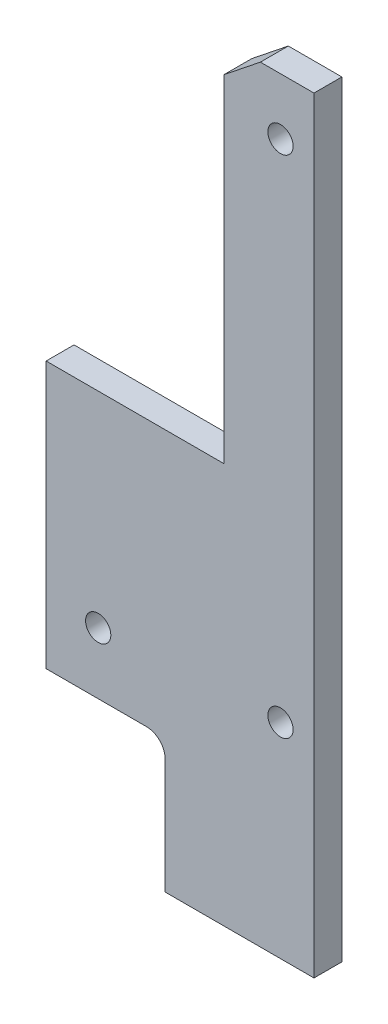
ISO-10303-21;
HEADER;
FILE_DESCRIPTION(('STEP AP214'),'2;1');
FILE_NAME('part.step','',(''),(''),'','','');
FILE_SCHEMA(('AUTOMOTIVE_DESIGN { 1 0 10303 214 1 1 1 1 }'));
ENDSEC;
DATA;
#1=APPLICATION_CONTEXT('core data for automotive mechanical design processes');
#2=APPLICATION_PROTOCOL_DEFINITION('international standard','automotive_design',2000,#1);
#3=PRODUCT_CONTEXT('',#1,'mechanical');
#4=PRODUCT('Part','Part','',(#3));
#5=PRODUCT_RELATED_PRODUCT_CATEGORY('part','',(#4));
#6=PRODUCT_DEFINITION_FORMATION('','',#4);
#7=PRODUCT_DEFINITION_CONTEXT('part definition',#1,'design');
#8=PRODUCT_DEFINITION('design','',#6,#7);
#9=PRODUCT_DEFINITION_SHAPE('','',#8);
#10=(LENGTH_UNIT() NAMED_UNIT(*) SI_UNIT(.MILLI.,.METRE.));
#11=(NAMED_UNIT(*) PLANE_ANGLE_UNIT() SI_UNIT($,.RADIAN.));
#12=(NAMED_UNIT(*) SI_UNIT($,.STERADIAN.) SOLID_ANGLE_UNIT());
#13=UNCERTAINTY_MEASURE_WITH_UNIT(LENGTH_MEASURE(1.E-05),#10,'distance_accuracy_value','');
#14=(GEOMETRIC_REPRESENTATION_CONTEXT(3) GLOBAL_UNCERTAINTY_ASSIGNED_CONTEXT((#13)) GLOBAL_UNIT_ASSIGNED_CONTEXT((#10,
#11,#12)) REPRESENTATION_CONTEXT('',''));
#15=CARTESIAN_POINT('',(0.,0.,0.));
#16=DIRECTION('',(0.,0.,1.));
#17=DIRECTION('',(1.,0.,0.));
#18=AXIS2_PLACEMENT_3D('',#15,#16,#17);
#19=CARTESIAN_POINT('',(-15.3921385119326,125.820167160609,4.7625));
#20=DIRECTION('',(0.624033070240707,-0.781397931431839,0.));
#21=DIRECTION('',(0.781397931431839,0.624033070240707,0.));
#22=AXIS2_PLACEMENT_3D('',#19,#20,#21);
#23=PLANE('',#22);
#24=DIRECTION('',(-0.781397931431839,-0.624033070240707,0.));
#25=VECTOR('',#24,1.);
#26=CARTESIAN_POINT('',(-15.3921385119326,125.820167160609,0.));
#27=LINE('',#26,#25);
#28=CARTESIAN_POINT('',(-9.144,130.81,0.));
#29=VERTEX_POINT('',#28);
#30=CARTESIAN_POINT('',(-15.3921385119326,125.820167160609,0.));
#31=VERTEX_POINT('',#30);
#32=EDGE_CURVE('E145',#29,#31,#27,.T.);
#33=ORIENTED_EDGE('',*,*,#32,.T.);
#34=DIRECTION('',(0.,0.,-1.));
#35=VECTOR('',#34,1.);
#36=CARTESIAN_POINT('',(-15.3921385119326,125.820167160609,4.7625));
#37=LINE('',#36,#35);
#38=CARTESIAN_POINT('',(-15.3921385119326,125.820167160609,4.7625));
#39=VERTEX_POINT('',#38);
#40=EDGE_CURVE('E11',#39,#31,#37,.T.);
#41=ORIENTED_EDGE('',*,*,#40,.F.);
#42=DIRECTION('',(-0.781397931431839,-0.624033070240707,0.));
#43=VECTOR('',#42,1.);
#44=CARTESIAN_POINT('',(-15.3921385119326,125.820167160609,4.7625));
#45=LINE('',#44,#43);
#46=CARTESIAN_POINT('',(-9.144,130.81,4.7625));
#47=VERTEX_POINT('',#46);
#48=EDGE_CURVE('E164',#47,#39,#45,.T.);
#49=ORIENTED_EDGE('',*,*,#48,.F.);
#50=DIRECTION('',(0.,0.,-1.));
#51=VECTOR('',#50,1.);
#52=CARTESIAN_POINT('',(-9.144,130.81,4.7625));
#53=LINE('',#52,#51);
#54=EDGE_CURVE('E141',#47,#29,#53,.T.);
#55=ORIENTED_EDGE('',*,*,#54,.T.);
#56=EDGE_LOOP('',(#33,#41,#49,#55));
#57=FACE_BOUND('',#56,.T.);
#58=ADVANCED_FACE('F37',(#57),#23,.F.);
#59=CARTESIAN_POINT('',(-15.3921385119326,125.820167160609,4.7625));
#60=DIRECTION('',(1.,0.,0.));
#61=DIRECTION('',(0.,1.,0.));
#62=AXIS2_PLACEMENT_3D('',#59,#60,#61);
#63=PLANE('',#62);
#64=DIRECTION('',(0.,-1.,0.));
#65=VECTOR('',#64,1.);
#66=CARTESIAN_POINT('',(-15.3921385119326,125.820167160609,0.));
#67=LINE('',#66,#65);
#68=CARTESIAN_POINT('',(-15.3921385119326,68.3431750116986,0.));
#69=VERTEX_POINT('',#68);
#70=EDGE_CURVE('E148',#31,#69,#67,.T.);
#71=ORIENTED_EDGE('',*,*,#70,.T.);
#72=DIRECTION('',(0.,0.,-1.));
#73=VECTOR('',#72,1.);
#74=CARTESIAN_POINT('',(-15.3921385119326,68.3431750116986,4.7625));
#75=LINE('',#74,#73);
#76=CARTESIAN_POINT('',(-15.3921385119326,68.3431750116986,4.7625));
#77=VERTEX_POINT('',#76);
#78=EDGE_CURVE('E45',#77,#69,#75,.T.);
#79=ORIENTED_EDGE('',*,*,#78,.F.);
#80=DIRECTION('',(0.,-1.,0.));
#81=VECTOR('',#80,1.);
#82=CARTESIAN_POINT('',(-15.3921385119326,125.820167160609,4.7625));
#83=LINE('',#82,#81);
#84=EDGE_CURVE('E102',#39,#77,#83,.T.);
#85=ORIENTED_EDGE('',*,*,#84,.F.);
#86=ORIENTED_EDGE('',*,*,#40,.T.);
#87=EDGE_LOOP('',(#71,#79,#85,#86));
#88=FACE_BOUND('',#87,.T.);
#89=ADVANCED_FACE('F258',(#88),#63,.F.);
#90=CARTESIAN_POINT('',(-15.3921385119326,68.3431750116986,4.7625));
#91=DIRECTION('',(0.,-1.,0.));
#92=DIRECTION('',(0.,0.,-1.));
#93=AXIS2_PLACEMENT_3D('',#90,#91,#92);
#94=PLANE('',#93);
#95=DIRECTION('',(-1.,0.,0.));
#96=VECTOR('',#95,1.);
#97=CARTESIAN_POINT('',(-15.3921385119326,68.3431750116986,0.));
#98=LINE('',#97,#96);
#99=CARTESIAN_POINT('',(-45.72,68.3431750116986,0.));
#100=VERTEX_POINT('',#99);
#101=EDGE_CURVE('E151',#69,#100,#98,.T.);
#102=ORIENTED_EDGE('',*,*,#101,.T.);
#103=DIRECTION('',(0.,0.,-1.));
#104=VECTOR('',#103,1.);
#105=CARTESIAN_POINT('',(-45.72,68.3431750116986,4.7625));
#106=LINE('',#105,#104);
#107=CARTESIAN_POINT('',(-45.72,68.3431750116986,4.7625));
#108=VERTEX_POINT('',#107);
#109=EDGE_CURVE('E177',#108,#100,#106,.T.);
#110=ORIENTED_EDGE('',*,*,#109,.F.);
#111=DIRECTION('',(-1.,0.,0.));
#112=VECTOR('',#111,1.);
#113=CARTESIAN_POINT('',(-15.3921385119326,68.3431750116986,4.7625));
#114=LINE('',#113,#112);
#115=EDGE_CURVE('E185',#77,#108,#114,.T.);
#116=ORIENTED_EDGE('',*,*,#115,.F.);
#117=ORIENTED_EDGE('',*,*,#78,.T.);
#118=EDGE_LOOP('',(#102,#110,#116,#117));
#119=FACE_BOUND('',#118,.T.);
#120=ADVANCED_FACE('F183',(#119),#94,.F.);
#121=CARTESIAN_POINT('',(-45.72,68.3431750116986,4.7625));
#122=DIRECTION('',(1.,0.,0.));
#123=DIRECTION('',(0.,1.,0.));
#124=AXIS2_PLACEMENT_3D('',#121,#122,#123);
#125=PLANE('',#124);
#126=DIRECTION('',(0.,-1.,0.));
#127=VECTOR('',#126,1.);
#128=CARTESIAN_POINT('',(-45.72,68.3431750116986,0.));
#129=LINE('',#128,#127);
#130=CARTESIAN_POINT('',(-45.72,22.86,0.));
#131=VERTEX_POINT('',#130);
#132=EDGE_CURVE('E153',#100,#131,#129,.T.);
#133=ORIENTED_EDGE('',*,*,#132,.T.);
#134=DIRECTION('',(0.,0.,-1.));
#135=VECTOR('',#134,1.);
#136=CARTESIAN_POINT('',(-45.72,22.86,4.7625));
#137=LINE('',#136,#135);
#138=CARTESIAN_POINT('',(-45.72,22.86,4.7625));
#139=VERTEX_POINT('',#138);
#140=EDGE_CURVE('E174',#139,#131,#137,.T.);
#141=ORIENTED_EDGE('',*,*,#140,.F.);
#142=DIRECTION('',(0.,-1.,0.));
#143=VECTOR('',#142,1.);
#144=CARTESIAN_POINT('',(-45.72,68.3431750116986,4.7625));
#145=LINE('',#144,#143);
#146=EDGE_CURVE('E203',#108,#139,#145,.T.);
#147=ORIENTED_EDGE('',*,*,#146,.F.);
#148=ORIENTED_EDGE('',*,*,#109,.T.);
#149=EDGE_LOOP('',(#133,#141,#147,#148));
#150=FACE_BOUND('',#149,.T.);
#151=ADVANCED_FACE('F194',(#150),#125,.F.);
#152=CARTESIAN_POINT('',(-45.72,22.86,4.7625));
#153=DIRECTION('',(0.,1.,0.));
#154=DIRECTION('',(0.,0.,1.));
#155=AXIS2_PLACEMENT_3D('',#152,#153,#154);
#156=PLANE('',#155);
#157=DIRECTION('',(1.,0.,0.));
#158=VECTOR('',#157,1.);
#159=CARTESIAN_POINT('',(-45.72,22.86,0.));
#160=LINE('',#159,#158);
#161=CARTESIAN_POINT('',(-28.575,22.86,0.));
#162=VERTEX_POINT('',#161);
#163=EDGE_CURVE('E155',#131,#162,#160,.T.);
#164=ORIENTED_EDGE('',*,*,#163,.T.);
#165=DIRECTION('',(0.,0.,-1.));
#166=VECTOR('',#165,1.);
#167=CARTESIAN_POINT('',(-28.575,22.86,4.7625));
#168=LINE('',#167,#166);
#169=CARTESIAN_POINT('',(-28.575,22.86,4.7625));
#170=VERTEX_POINT('',#169);
#171=EDGE_CURVE('E171',#170,#162,#168,.T.);
#172=ORIENTED_EDGE('',*,*,#171,.F.);
#173=DIRECTION('',(1.,0.,0.));
#174=VECTOR('',#173,1.);
#175=CARTESIAN_POINT('',(-45.72,22.86,4.7625));
#176=LINE('',#175,#174);
#177=EDGE_CURVE('E200',#139,#170,#176,.T.);
#178=ORIENTED_EDGE('',*,*,#177,.F.);
#179=ORIENTED_EDGE('',*,*,#140,.T.);
#180=EDGE_LOOP('',(#164,#172,#178,#179));
#181=FACE_BOUND('',#180,.T.);
#182=ADVANCED_FACE('F198',(#181),#156,.F.);
#183=CARTESIAN_POINT('',(-28.575,19.685,4.7625));
#184=DIRECTION('',(0.,0.,-1.));
#185=DIRECTION('',(-1.,0.,0.));
#186=AXIS2_PLACEMENT_3D('',#183,#184,#185);
#187=CYLINDRICAL_SURFACE('',#186,3.17499999999999);
#188=CARTESIAN_POINT('',(-28.575,19.685,0.));
#189=DIRECTION('',(0.,0.,-1.));
#190=DIRECTION('',(1.,0.,0.));
#191=AXIS2_PLACEMENT_3D('',#188,#189,#190);
#192=CIRCLE('',#191,3.17499999999999);
#193=CARTESIAN_POINT('',(-25.4,19.685,0.));
#194=VERTEX_POINT('',#193);
#195=EDGE_CURVE('E157',#162,#194,#192,.T.);
#196=ORIENTED_EDGE('',*,*,#195,.T.);
#197=DIRECTION('',(0.,0.,-1.));
#198=VECTOR('',#197,1.);
#199=CARTESIAN_POINT('',(-25.4,19.685,4.7625));
#200=LINE('',#199,#198);
#201=CARTESIAN_POINT('',(-25.4,19.685,4.7625));
#202=VERTEX_POINT('',#201);
#203=EDGE_CURVE('E168',#202,#194,#200,.T.);
#204=ORIENTED_EDGE('',*,*,#203,.F.);
#205=CARTESIAN_POINT('',(-28.575,19.685,4.7625));
#206=DIRECTION('',(0.,0.,-1.));
#207=DIRECTION('',(1.,0.,0.));
#208=AXIS2_PLACEMENT_3D('',#205,#206,#207);
#209=CIRCLE('',#208,3.17499999999999);
#210=EDGE_CURVE('E202',#170,#202,#209,.T.);
#211=ORIENTED_EDGE('',*,*,#210,.F.);
#212=ORIENTED_EDGE('',*,*,#171,.T.);
#213=EDGE_LOOP('',(#196,#204,#211,#212));
#214=FACE_BOUND('',#213,.T.);
#215=ADVANCED_FACE('F270',(#214),#187,.F.);
#216=CARTESIAN_POINT('',(-25.4,19.685,4.7625));
#217=DIRECTION('',(1.,0.,0.));
#218=DIRECTION('',(0.,1.,0.));
#219=AXIS2_PLACEMENT_3D('',#216,#217,#218);
#220=PLANE('',#219);
#221=DIRECTION('',(0.,-1.,0.));
#222=VECTOR('',#221,1.);
#223=CARTESIAN_POINT('',(-25.4,19.685,0.));
#224=LINE('',#223,#222);
#225=CARTESIAN_POINT('',(-25.4,0.,0.));
#226=VERTEX_POINT('',#225);
#227=EDGE_CURVE('E159',#194,#226,#224,.T.);
#228=ORIENTED_EDGE('',*,*,#227,.T.);
#229=DIRECTION('',(0.,0.,-1.));
#230=VECTOR('',#229,1.);
#231=CARTESIAN_POINT('',(-25.4,0.,4.7625));
#232=LINE('',#231,#230);
#233=CARTESIAN_POINT('',(-25.4,0.,4.7625));
#234=VERTEX_POINT('',#233);
#235=EDGE_CURVE('E136',#234,#226,#232,.T.);
#236=ORIENTED_EDGE('',*,*,#235,.F.);
#237=DIRECTION('',(0.,-1.,0.));
#238=VECTOR('',#237,1.);
#239=CARTESIAN_POINT('',(-25.4,19.685,4.7625));
#240=LINE('',#239,#238);
#241=EDGE_CURVE('E127',#202,#234,#240,.T.);
#242=ORIENTED_EDGE('',*,*,#241,.F.);
#243=ORIENTED_EDGE('',*,*,#203,.T.);
#244=EDGE_LOOP('',(#228,#236,#242,#243));
#245=FACE_BOUND('',#244,.T.);
#246=ADVANCED_FACE('F267',(#245),#220,.F.);
#247=CARTESIAN_POINT('',(-25.4,0.,4.7625));
#248=DIRECTION('',(0.,1.,0.));
#249=DIRECTION('',(0.,0.,1.));
#250=AXIS2_PLACEMENT_3D('',#247,#248,#249);
#251=PLANE('',#250);
#252=DIRECTION('',(1.,0.,0.));
#253=VECTOR('',#252,1.);
#254=CARTESIAN_POINT('',(-25.4,0.,0.));
#255=LINE('',#254,#253);
#256=CARTESIAN_POINT('',(0.,0.,0.));
#257=VERTEX_POINT('',#256);
#258=EDGE_CURVE('E135',#226,#257,#255,.T.);
#259=ORIENTED_EDGE('',*,*,#258,.T.);
#260=DIRECTION('',(0.,0.,-1.));
#261=VECTOR('',#260,1.);
#262=CARTESIAN_POINT('',(0.,0.,4.7625));
#263=LINE('',#262,#261);
#264=CARTESIAN_POINT('',(0.,0.,4.7625));
#265=VERTEX_POINT('',#264);
#266=EDGE_CURVE('E132',#265,#257,#263,.T.);
#267=ORIENTED_EDGE('',*,*,#266,.F.);
#268=DIRECTION('',(1.,0.,0.));
#269=VECTOR('',#268,1.);
#270=CARTESIAN_POINT('',(-25.4,0.,4.7625));
#271=LINE('',#270,#269);
#272=EDGE_CURVE('E121',#234,#265,#271,.T.);
#273=ORIENTED_EDGE('',*,*,#272,.F.);
#274=ORIENTED_EDGE('',*,*,#235,.T.);
#275=EDGE_LOOP('',(#259,#267,#273,#274));
#276=FACE_BOUND('',#275,.T.);
#277=ADVANCED_FACE('F133',(#276),#251,.F.);
#278=CARTESIAN_POINT('',(0.,130.81,4.7625));
#279=DIRECTION('',(-1.,0.,0.));
#280=DIRECTION('',(0.,-1.,0.));
#281=AXIS2_PLACEMENT_3D('',#278,#279,#280);
#282=PLANE('',#281);
#283=DIRECTION('',(0.,1.,0.));
#284=VECTOR('',#283,1.);
#285=CARTESIAN_POINT('',(0.,130.81,0.));
#286=LINE('',#285,#284);
#287=CARTESIAN_POINT('',(0.,130.81,0.));
#288=VERTEX_POINT('',#287);
#289=EDGE_CURVE('E88',#257,#288,#286,.T.);
#290=ORIENTED_EDGE('',*,*,#289,.T.);
#291=DIRECTION('',(0.,0.,-1.));
#292=VECTOR('',#291,1.);
#293=CARTESIAN_POINT('',(0.,130.81,4.7625));
#294=LINE('',#293,#292);
#295=CARTESIAN_POINT('',(0.,130.81,4.7625));
#296=VERTEX_POINT('',#295);
#297=EDGE_CURVE('E137',#296,#288,#294,.T.);
#298=ORIENTED_EDGE('',*,*,#297,.F.);
#299=DIRECTION('',(0.,1.,0.));
#300=VECTOR('',#299,1.);
#301=CARTESIAN_POINT('',(0.,130.81,4.7625));
#302=LINE('',#301,#300);
#303=EDGE_CURVE('E125',#265,#296,#302,.T.);
#304=ORIENTED_EDGE('',*,*,#303,.F.);
#305=ORIENTED_EDGE('',*,*,#266,.T.);
#306=EDGE_LOOP('',(#290,#298,#304,#305));
#307=FACE_BOUND('',#306,.T.);
#308=ADVANCED_FACE('F139',(#307),#282,.F.);
#309=CARTESIAN_POINT('',(-9.144,130.81,4.7625));
#310=DIRECTION('',(0.,-1.,0.));
#311=DIRECTION('',(0.,0.,-1.));
#312=AXIS2_PLACEMENT_3D('',#309,#310,#311);
#313=PLANE('',#312);
#314=DIRECTION('',(-1.,0.,0.));
#315=VECTOR('',#314,1.);
#316=CARTESIAN_POINT('',(-9.144,130.81,0.));
#317=LINE('',#316,#315);
#318=EDGE_CURVE('E94',#288,#29,#317,.T.);
#319=ORIENTED_EDGE('',*,*,#318,.T.);
#320=ORIENTED_EDGE('',*,*,#54,.F.);
#321=DIRECTION('',(-1.,0.,0.));
#322=VECTOR('',#321,1.);
#323=CARTESIAN_POINT('',(-9.144,130.81,4.7625));
#324=LINE('',#323,#322);
#325=EDGE_CURVE('E53',#296,#47,#324,.T.);
#326=ORIENTED_EDGE('',*,*,#325,.F.);
#327=ORIENTED_EDGE('',*,*,#297,.T.);
#328=EDGE_LOOP('',(#319,#320,#326,#327));
#329=FACE_BOUND('',#328,.T.);
#330=ADVANCED_FACE('F322',(#329),#313,.F.);
#331=CARTESIAN_POINT('',(-28.575,19.685,4.7625));
#332=DIRECTION('',(0.,0.,1.));
#333=DIRECTION('',(1.,0.,0.));
#334=AXIS2_PLACEMENT_3D('',#331,#332,#333);
#335=PLANE('',#334);
#336=CARTESIAN_POINT('',(-5.715,121.158,4.7625));
#337=DIRECTION('',(0.,0.,-1.));
#338=DIRECTION('',(-1.,0.,0.));
#339=AXIS2_PLACEMENT_3D('',#336,#337,#338);
#340=CIRCLE('',#339,2.15265);
#341=CARTESIAN_POINT('',(-7.86765,121.158,4.7625));
#342=VERTEX_POINT('',#341);
#343=EDGE_CURVE('E149',#342,#342,#340,.T.);
#344=ORIENTED_EDGE('',*,*,#343,.T.);
#345=EDGE_LOOP('',(#344));
#346=FACE_BOUND('',#345,.T.);
#347=CARTESIAN_POINT('',(-36.83,33.3375,4.7625));
#348=DIRECTION('',(0.,0.,-1.));
#349=DIRECTION('',(-1.,0.,0.));
#350=AXIS2_PLACEMENT_3D('',#347,#348,#349);
#351=CIRCLE('',#350,2.15265);
#352=CARTESIAN_POINT('',(-38.98265,33.3375,4.7625));
#353=VERTEX_POINT('',#352);
#354=EDGE_CURVE('E220',#353,#353,#351,.T.);
#355=ORIENTED_EDGE('',*,*,#354,.T.);
#356=EDGE_LOOP('',(#355));
#357=FACE_BOUND('',#356,.T.);
#358=CARTESIAN_POINT('',(-5.715,34.925,4.7625));
#359=DIRECTION('',(0.,0.,-1.));
#360=DIRECTION('',(-1.,0.,0.));
#361=AXIS2_PLACEMENT_3D('',#358,#359,#360);
#362=CIRCLE('',#361,2.15265);
#363=CARTESIAN_POINT('',(-7.86764999999999,34.925,4.7625));
#364=VERTEX_POINT('',#363);
#365=EDGE_CURVE('E214',#364,#364,#362,.T.);
#366=ORIENTED_EDGE('',*,*,#365,.T.);
#367=EDGE_LOOP('',(#366));
#368=FACE_BOUND('',#367,.T.);
#369=ORIENTED_EDGE('',*,*,#48,.T.);
#370=ORIENTED_EDGE('',*,*,#84,.T.);
#371=ORIENTED_EDGE('',*,*,#115,.T.);
#372=ORIENTED_EDGE('',*,*,#146,.T.);
#373=ORIENTED_EDGE('',*,*,#177,.T.);
#374=ORIENTED_EDGE('',*,*,#210,.T.);
#375=ORIENTED_EDGE('',*,*,#241,.T.);
#376=ORIENTED_EDGE('',*,*,#272,.T.);
#377=ORIENTED_EDGE('',*,*,#303,.T.);
#378=ORIENTED_EDGE('',*,*,#325,.T.);
#379=EDGE_LOOP('',(#369,#370,#371,#372,#373,#374,#375,#376,#377,#378));
#380=FACE_BOUND('',#379,.T.);
#381=ADVANCED_FACE('F123',(#346,#357,#368,#380),#335,.T.);
#382=CARTESIAN_POINT('',(-28.575,19.685,0.));
#383=DIRECTION('',(0.,0.,1.));
#384=DIRECTION('',(1.,0.,0.));
#385=AXIS2_PLACEMENT_3D('',#382,#383,#384);
#386=PLANE('',#385);
#387=CARTESIAN_POINT('',(-5.715,121.158,0.));
#388=DIRECTION('',(0.,0.,-1.));
#389=DIRECTION('',(-1.,0.,0.));
#390=AXIS2_PLACEMENT_3D('',#387,#388,#389);
#391=CIRCLE('',#390,2.15265);
#392=CARTESIAN_POINT('',(-7.86765,121.158,0.));
#393=VERTEX_POINT('',#392);
#394=EDGE_CURVE('E223',#393,#393,#391,.T.);
#395=ORIENTED_EDGE('',*,*,#394,.F.);
#396=EDGE_LOOP('',(#395));
#397=FACE_BOUND('',#396,.T.);
#398=CARTESIAN_POINT('',(-36.83,33.3375,0.));
#399=DIRECTION('',(0.,0.,-1.));
#400=DIRECTION('',(-1.,0.,0.));
#401=AXIS2_PLACEMENT_3D('',#398,#399,#400);
#402=CIRCLE('',#401,2.15265);
#403=CARTESIAN_POINT('',(-38.98265,33.3375,0.));
#404=VERTEX_POINT('',#403);
#405=EDGE_CURVE('E217',#404,#404,#402,.T.);
#406=ORIENTED_EDGE('',*,*,#405,.F.);
#407=EDGE_LOOP('',(#406));
#408=FACE_BOUND('',#407,.T.);
#409=CARTESIAN_POINT('',(-5.715,34.925,0.));
#410=DIRECTION('',(0.,0.,-1.));
#411=DIRECTION('',(-1.,0.,0.));
#412=AXIS2_PLACEMENT_3D('',#409,#410,#411);
#413=CIRCLE('',#412,2.15265);
#414=CARTESIAN_POINT('',(-7.86764999999999,34.925,0.));
#415=VERTEX_POINT('',#414);
#416=EDGE_CURVE('E211',#415,#415,#413,.T.);
#417=ORIENTED_EDGE('',*,*,#416,.F.);
#418=EDGE_LOOP('',(#417));
#419=FACE_BOUND('',#418,.T.);
#420=ORIENTED_EDGE('',*,*,#32,.F.);
#421=ORIENTED_EDGE('',*,*,#318,.F.);
#422=ORIENTED_EDGE('',*,*,#289,.F.);
#423=ORIENTED_EDGE('',*,*,#258,.F.);
#424=ORIENTED_EDGE('',*,*,#227,.F.);
#425=ORIENTED_EDGE('',*,*,#195,.F.);
#426=ORIENTED_EDGE('',*,*,#163,.F.);
#427=ORIENTED_EDGE('',*,*,#132,.F.);
#428=ORIENTED_EDGE('',*,*,#101,.F.);
#429=ORIENTED_EDGE('',*,*,#70,.F.);
#430=EDGE_LOOP('',(#420,#421,#422,#423,#424,#425,#426,#427,#428,#429));
#431=FACE_BOUND('',#430,.T.);
#432=ADVANCED_FACE('F189',(#397,#408,#419,#431),#386,.F.);
#433=CARTESIAN_POINT('',(-5.715,34.925,4.7625));
#434=DIRECTION('',(0.,0.,-1.));
#435=DIRECTION('',(-1.,0.,0.));
#436=AXIS2_PLACEMENT_3D('',#433,#434,#435);
#437=CYLINDRICAL_SURFACE('',#436,2.15265);
#438=CARTESIAN_POINT('',(-7.86764999999999,34.925,4.7625));
#439=CARTESIAN_POINT('',(-7.86764999999999,34.925,4.712890625));
#440=CARTESIAN_POINT('',(-7.86764999999999,34.925,4.66328125));
#441=CARTESIAN_POINT('',(-7.86764999999999,34.925,4.5640625));
#442=CARTESIAN_POINT('',(-7.86764999999999,34.925,4.514453125));
#443=CARTESIAN_POINT('',(-7.86764999999999,34.925,4.415234375));
#444=CARTESIAN_POINT('',(-7.86764999999999,34.925,4.365625));
#445=CARTESIAN_POINT('',(-7.86764999999999,34.925,4.26640625));
#446=CARTESIAN_POINT('',(-7.86764999999999,34.925,4.216796875));
#447=CARTESIAN_POINT('',(-7.86764999999999,34.925,4.117578125));
#448=CARTESIAN_POINT('',(-7.86764999999999,34.925,4.06796875));
#449=CARTESIAN_POINT('',(-7.86764999999999,34.925,3.96875));
#450=CARTESIAN_POINT('',(-7.86764999999999,34.925,3.919140625));
#451=CARTESIAN_POINT('',(-7.86764999999999,34.925,3.819921875));
#452=CARTESIAN_POINT('',(-7.86764999999999,34.925,3.7703125));
#453=CARTESIAN_POINT('',(-7.86764999999999,34.925,3.67109375));
#454=CARTESIAN_POINT('',(-7.86764999999999,34.925,3.621484375));
#455=CARTESIAN_POINT('',(-7.86764999999999,34.925,3.522265625));
#456=CARTESIAN_POINT('',(-7.86764999999999,34.925,3.47265625));
#457=CARTESIAN_POINT('',(-7.86764999999999,34.925,3.3734375));
#458=CARTESIAN_POINT('',(-7.86764999999999,34.925,3.323828125));
#459=CARTESIAN_POINT('',(-7.86764999999999,34.925,3.224609375));
#460=CARTESIAN_POINT('',(-7.86764999999999,34.925,3.175));
#461=CARTESIAN_POINT('',(-7.86764999999999,34.925,3.07578125));
#462=CARTESIAN_POINT('',(-7.86764999999999,34.925,3.026171875));
#463=CARTESIAN_POINT('',(-7.86764999999999,34.925,2.926953125));
#464=CARTESIAN_POINT('',(-7.86764999999999,34.925,2.87734375));
#465=CARTESIAN_POINT('',(-7.86764999999999,34.925,2.778125));
#466=CARTESIAN_POINT('',(-7.86764999999999,34.925,2.728515625));
#467=CARTESIAN_POINT('',(-7.86764999999999,34.925,2.629296875));
#468=CARTESIAN_POINT('',(-7.86764999999999,34.925,2.5796875));
#469=CARTESIAN_POINT('',(-7.86764999999999,34.925,2.48046875));
#470=CARTESIAN_POINT('',(-7.86764999999999,34.925,2.430859375));
#471=CARTESIAN_POINT('',(-7.86764999999999,34.925,2.331640625));
#472=CARTESIAN_POINT('',(-7.86764999999999,34.925,2.28203125));
#473=CARTESIAN_POINT('',(-7.86764999999999,34.925,2.1828125));
#474=CARTESIAN_POINT('',(-7.86764999999999,34.925,2.133203125));
#475=CARTESIAN_POINT('',(-7.86764999999999,34.925,2.033984375));
#476=CARTESIAN_POINT('',(-7.86764999999999,34.925,1.984375));
#477=CARTESIAN_POINT('',(-7.86764999999999,34.925,1.88515625));
#478=CARTESIAN_POINT('',(-7.86764999999999,34.925,1.835546875));
#479=CARTESIAN_POINT('',(-7.86764999999999,34.925,1.736328125));
#480=CARTESIAN_POINT('',(-7.86764999999999,34.925,1.68671875));
#481=CARTESIAN_POINT('',(-7.86764999999999,34.925,1.5875));
#482=CARTESIAN_POINT('',(-7.86764999999999,34.925,1.537890625));
#483=CARTESIAN_POINT('',(-7.86764999999999,34.925,1.438671875));
#484=CARTESIAN_POINT('',(-7.86764999999999,34.925,1.3890625));
#485=CARTESIAN_POINT('',(-7.86764999999999,34.925,1.28984375));
#486=CARTESIAN_POINT('',(-7.86764999999999,34.925,1.240234375));
#487=CARTESIAN_POINT('',(-7.86764999999999,34.925,1.141015625));
#488=CARTESIAN_POINT('',(-7.86764999999999,34.925,1.09140625));
#489=CARTESIAN_POINT('',(-7.86764999999999,34.925,0.9921875));
#490=CARTESIAN_POINT('',(-7.86764999999999,34.925,0.942578125));
#491=CARTESIAN_POINT('',(-7.86764999999999,34.925,0.843359375));
#492=CARTESIAN_POINT('',(-7.86764999999999,34.925,0.79375));
#493=CARTESIAN_POINT('',(-7.86764999999999,34.925,0.69453125));
#494=CARTESIAN_POINT('',(-7.86764999999999,34.925,0.644921875));
#495=CARTESIAN_POINT('',(-7.86764999999999,34.925,0.545703125));
#496=CARTESIAN_POINT('',(-7.86764999999999,34.925,0.49609375));
#497=CARTESIAN_POINT('',(-7.86764999999999,34.925,0.396875));
#498=CARTESIAN_POINT('',(-7.86764999999999,34.925,0.347265625));
#499=CARTESIAN_POINT('',(-7.86764999999999,34.925,0.248046875));
#500=CARTESIAN_POINT('',(-7.86764999999999,34.925,0.1984375));
#501=CARTESIAN_POINT('',(-7.86764999999999,34.925,0.09921875));
#502=CARTESIAN_POINT('',(-7.86764999999999,34.925,0.049609375));
#503=CARTESIAN_POINT('',(-7.86764999999999,34.925,0.));
#504=B_SPLINE_CURVE_WITH_KNOTS('',3,(#438,#439,#440,#441,#442,#443,#444,#445,#446,#447,#448,
#449,#450,#451,#452,#453,#454,#455,#456,#457,#458,#459,#460,#461,#462,#463,#464,#465,#466,#467,
#468,#469,#470,#471,#472,#473,#474,#475,#476,#477,#478,#479,#480,#481,#482,#483,#484,#485,#486,
#487,#488,#489,#490,#491,#492,#493,#494,#495,#496,#497,#498,#499,#500,#501,#502,#503),
.UNSPECIFIED.,.F.,.F.,(4,2,2,2,2,2,2,2,2,2,2,2,2,2,2,2,2,2,2,2,2,2,2,2,2,2,2,2,2,2,2,2,4),(0.,
0.148828125,0.29765625,0.446484375,0.5953125,0.744140625,0.892968750000001,1.041796875,1.190625,
1.339453125,1.48828125,1.637109375,1.7859375,1.934765625,2.08359375,2.232421875,2.38125,
2.530078125,2.67890625,2.827734375,2.9765625,3.125390625,3.27421875,3.423046875,3.571875,
3.720703125,3.86953125,4.018359375,4.1671875,4.316015625,4.46484375,4.613671875,4.7625),.UNSPECIFIED.);
#505=EDGE_CURVE('BSEAM240',#364,#415,#504,.T.);
#506=ORIENTED_EDGE('',*,*,#365,.F.);
#507=ORIENTED_EDGE('',*,*,#416,.T.);
#508=ORIENTED_EDGE('',*,*,#505,.T.);
#509=ORIENTED_EDGE('',*,*,#505,.F.);
#510=EDGE_LOOP('',(#506,#508,#507,#509));
#511=FACE_BOUND('',#510,.T.);
#512=ADVANCED_FACE('F240',(#511),#437,.F.);
#513=CARTESIAN_POINT('',(-36.83,33.3375,4.7625));
#514=DIRECTION('',(0.,0.,-1.));
#515=DIRECTION('',(-1.,0.,0.));
#516=AXIS2_PLACEMENT_3D('',#513,#514,#515);
#517=CYLINDRICAL_SURFACE('',#516,2.15265);
#518=CARTESIAN_POINT('',(-38.98265,33.3375,4.7625));
#519=CARTESIAN_POINT('',(-38.98265,33.3375,4.712890625));
#520=CARTESIAN_POINT('',(-38.98265,33.3375,4.66328125));
#521=CARTESIAN_POINT('',(-38.98265,33.3375,4.5640625));
#522=CARTESIAN_POINT('',(-38.98265,33.3375,4.514453125));
#523=CARTESIAN_POINT('',(-38.98265,33.3375,4.415234375));
#524=CARTESIAN_POINT('',(-38.98265,33.3375,4.365625));
#525=CARTESIAN_POINT('',(-38.98265,33.3375,4.26640625));
#526=CARTESIAN_POINT('',(-38.98265,33.3375,4.216796875));
#527=CARTESIAN_POINT('',(-38.98265,33.3375,4.117578125));
#528=CARTESIAN_POINT('',(-38.98265,33.3375,4.06796875));
#529=CARTESIAN_POINT('',(-38.98265,33.3375,3.96875));
#530=CARTESIAN_POINT('',(-38.98265,33.3375,3.919140625));
#531=CARTESIAN_POINT('',(-38.98265,33.3375,3.819921875));
#532=CARTESIAN_POINT('',(-38.98265,33.3375,3.7703125));
#533=CARTESIAN_POINT('',(-38.98265,33.3375,3.67109375));
#534=CARTESIAN_POINT('',(-38.98265,33.3375,3.621484375));
#535=CARTESIAN_POINT('',(-38.98265,33.3375,3.522265625));
#536=CARTESIAN_POINT('',(-38.98265,33.3375,3.47265625));
#537=CARTESIAN_POINT('',(-38.98265,33.3375,3.3734375));
#538=CARTESIAN_POINT('',(-38.98265,33.3375,3.323828125));
#539=CARTESIAN_POINT('',(-38.98265,33.3375,3.224609375));
#540=CARTESIAN_POINT('',(-38.98265,33.3375,3.175));
#541=CARTESIAN_POINT('',(-38.98265,33.3375,3.07578125));
#542=CARTESIAN_POINT('',(-38.98265,33.3375,3.026171875));
#543=CARTESIAN_POINT('',(-38.98265,33.3375,2.926953125));
#544=CARTESIAN_POINT('',(-38.98265,33.3375,2.87734375));
#545=CARTESIAN_POINT('',(-38.98265,33.3375,2.778125));
#546=CARTESIAN_POINT('',(-38.98265,33.3375,2.728515625));
#547=CARTESIAN_POINT('',(-38.98265,33.3375,2.629296875));
#548=CARTESIAN_POINT('',(-38.98265,33.3375,2.5796875));
#549=CARTESIAN_POINT('',(-38.98265,33.3375,2.48046875));
#550=CARTESIAN_POINT('',(-38.98265,33.3375,2.430859375));
#551=CARTESIAN_POINT('',(-38.98265,33.3375,2.331640625));
#552=CARTESIAN_POINT('',(-38.98265,33.3375,2.28203125));
#553=CARTESIAN_POINT('',(-38.98265,33.3375,2.1828125));
#554=CARTESIAN_POINT('',(-38.98265,33.3375,2.133203125));
#555=CARTESIAN_POINT('',(-38.98265,33.3375,2.033984375));
#556=CARTESIAN_POINT('',(-38.98265,33.3375,1.984375));
#557=CARTESIAN_POINT('',(-38.98265,33.3375,1.88515625));
#558=CARTESIAN_POINT('',(-38.98265,33.3375,1.835546875));
#559=CARTESIAN_POINT('',(-38.98265,33.3375,1.736328125));
#560=CARTESIAN_POINT('',(-38.98265,33.3375,1.68671875));
#561=CARTESIAN_POINT('',(-38.98265,33.3375,1.5875));
#562=CARTESIAN_POINT('',(-38.98265,33.3375,1.537890625));
#563=CARTESIAN_POINT('',(-38.98265,33.3375,1.438671875));
#564=CARTESIAN_POINT('',(-38.98265,33.3375,1.3890625));
#565=CARTESIAN_POINT('',(-38.98265,33.3375,1.28984375));
#566=CARTESIAN_POINT('',(-38.98265,33.3375,1.240234375));
#567=CARTESIAN_POINT('',(-38.98265,33.3375,1.141015625));
#568=CARTESIAN_POINT('',(-38.98265,33.3375,1.09140625));
#569=CARTESIAN_POINT('',(-38.98265,33.3375,0.9921875));
#570=CARTESIAN_POINT('',(-38.98265,33.3375,0.942578125));
#571=CARTESIAN_POINT('',(-38.98265,33.3375,0.843359375));
#572=CARTESIAN_POINT('',(-38.98265,33.3375,0.79375));
#573=CARTESIAN_POINT('',(-38.98265,33.3375,0.69453125));
#574=CARTESIAN_POINT('',(-38.98265,33.3375,0.644921875));
#575=CARTESIAN_POINT('',(-38.98265,33.3375,0.545703125));
#576=CARTESIAN_POINT('',(-38.98265,33.3375,0.49609375));
#577=CARTESIAN_POINT('',(-38.98265,33.3375,0.396875));
#578=CARTESIAN_POINT('',(-38.98265,33.3375,0.347265625));
#579=CARTESIAN_POINT('',(-38.98265,33.3375,0.248046875));
#580=CARTESIAN_POINT('',(-38.98265,33.3375,0.1984375));
#581=CARTESIAN_POINT('',(-38.98265,33.3375,0.09921875));
#582=CARTESIAN_POINT('',(-38.98265,33.3375,0.049609375));
#583=CARTESIAN_POINT('',(-38.98265,33.3375,0.));
#584=B_SPLINE_CURVE_WITH_KNOTS('',3,(#518,#519,#520,#521,#522,#523,#524,#525,#526,#527,#528,
#529,#530,#531,#532,#533,#534,#535,#536,#537,#538,#539,#540,#541,#542,#543,#544,#545,#546,#547,
#548,#549,#550,#551,#552,#553,#554,#555,#556,#557,#558,#559,#560,#561,#562,#563,#564,#565,#566,
#567,#568,#569,#570,#571,#572,#573,#574,#575,#576,#577,#578,#579,#580,#581,#582,#583),
.UNSPECIFIED.,.F.,.F.,(4,2,2,2,2,2,2,2,2,2,2,2,2,2,2,2,2,2,2,2,2,2,2,2,2,2,2,2,2,2,2,2,4),(0.,
0.148828125,0.29765625,0.446484375,0.5953125,0.744140625,0.892968750000001,1.041796875,1.190625,
1.339453125,1.48828125,1.637109375,1.7859375,1.934765625,2.08359375,2.232421875,2.38125,
2.530078125,2.67890625,2.827734375,2.9765625,3.125390625,3.27421875,3.423046875,3.571875,
3.720703125,3.86953125,4.018359375,4.1671875,4.316015625,4.46484375,4.613671875,4.7625),.UNSPECIFIED.);
#585=EDGE_CURVE('BSEAM234',#353,#404,#584,.T.);
#586=ORIENTED_EDGE('',*,*,#354,.F.);
#587=ORIENTED_EDGE('',*,*,#405,.T.);
#588=ORIENTED_EDGE('',*,*,#585,.T.);
#589=ORIENTED_EDGE('',*,*,#585,.F.);
#590=EDGE_LOOP('',(#586,#588,#587,#589));
#591=FACE_BOUND('',#590,.T.);
#592=ADVANCED_FACE('F234',(#591),#517,.F.);
#593=CARTESIAN_POINT('',(-5.715,121.158,4.7625));
#594=DIRECTION('',(0.,0.,-1.));
#595=DIRECTION('',(-1.,0.,0.));
#596=AXIS2_PLACEMENT_3D('',#593,#594,#595);
#597=CYLINDRICAL_SURFACE('',#596,2.15265);
#598=CARTESIAN_POINT('',(-7.86765,121.158,4.7625));
#599=CARTESIAN_POINT('',(-7.86765,121.158,4.712890625));
#600=CARTESIAN_POINT('',(-7.86765,121.158,4.66328125));
#601=CARTESIAN_POINT('',(-7.86765,121.158,4.5640625));
#602=CARTESIAN_POINT('',(-7.86765,121.158,4.514453125));
#603=CARTESIAN_POINT('',(-7.86765,121.158,4.415234375));
#604=CARTESIAN_POINT('',(-7.86765,121.158,4.365625));
#605=CARTESIAN_POINT('',(-7.86765,121.158,4.26640625));
#606=CARTESIAN_POINT('',(-7.86765,121.158,4.216796875));
#607=CARTESIAN_POINT('',(-7.86765,121.158,4.117578125));
#608=CARTESIAN_POINT('',(-7.86765,121.158,4.06796875));
#609=CARTESIAN_POINT('',(-7.86765,121.158,3.96875));
#610=CARTESIAN_POINT('',(-7.86765,121.158,3.919140625));
#611=CARTESIAN_POINT('',(-7.86765,121.158,3.819921875));
#612=CARTESIAN_POINT('',(-7.86765,121.158,3.7703125));
#613=CARTESIAN_POINT('',(-7.86765,121.158,3.67109375));
#614=CARTESIAN_POINT('',(-7.86765,121.158,3.621484375));
#615=CARTESIAN_POINT('',(-7.86765,121.158,3.522265625));
#616=CARTESIAN_POINT('',(-7.86765,121.158,3.47265625));
#617=CARTESIAN_POINT('',(-7.86765,121.158,3.3734375));
#618=CARTESIAN_POINT('',(-7.86765,121.158,3.323828125));
#619=CARTESIAN_POINT('',(-7.86765,121.158,3.224609375));
#620=CARTESIAN_POINT('',(-7.86765,121.158,3.175));
#621=CARTESIAN_POINT('',(-7.86765,121.158,3.07578125));
#622=CARTESIAN_POINT('',(-7.86765,121.158,3.026171875));
#623=CARTESIAN_POINT('',(-7.86765,121.158,2.926953125));
#624=CARTESIAN_POINT('',(-7.86765,121.158,2.87734375));
#625=CARTESIAN_POINT('',(-7.86765,121.158,2.778125));
#626=CARTESIAN_POINT('',(-7.86765,121.158,2.728515625));
#627=CARTESIAN_POINT('',(-7.86765,121.158,2.629296875));
#628=CARTESIAN_POINT('',(-7.86765,121.158,2.5796875));
#629=CARTESIAN_POINT('',(-7.86765,121.158,2.48046875));
#630=CARTESIAN_POINT('',(-7.86765,121.158,2.430859375));
#631=CARTESIAN_POINT('',(-7.86765,121.158,2.331640625));
#632=CARTESIAN_POINT('',(-7.86765,121.158,2.28203125));
#633=CARTESIAN_POINT('',(-7.86765,121.158,2.1828125));
#634=CARTESIAN_POINT('',(-7.86765,121.158,2.133203125));
#635=CARTESIAN_POINT('',(-7.86765,121.158,2.033984375));
#636=CARTESIAN_POINT('',(-7.86765,121.158,1.984375));
#637=CARTESIAN_POINT('',(-7.86765,121.158,1.88515625));
#638=CARTESIAN_POINT('',(-7.86765,121.158,1.835546875));
#639=CARTESIAN_POINT('',(-7.86765,121.158,1.736328125));
#640=CARTESIAN_POINT('',(-7.86765,121.158,1.68671875));
#641=CARTESIAN_POINT('',(-7.86765,121.158,1.5875));
#642=CARTESIAN_POINT('',(-7.86765,121.158,1.537890625));
#643=CARTESIAN_POINT('',(-7.86765,121.158,1.438671875));
#644=CARTESIAN_POINT('',(-7.86765,121.158,1.3890625));
#645=CARTESIAN_POINT('',(-7.86765,121.158,1.28984375));
#646=CARTESIAN_POINT('',(-7.86765,121.158,1.240234375));
#647=CARTESIAN_POINT('',(-7.86765,121.158,1.141015625));
#648=CARTESIAN_POINT('',(-7.86765,121.158,1.09140625));
#649=CARTESIAN_POINT('',(-7.86765,121.158,0.9921875));
#650=CARTESIAN_POINT('',(-7.86765,121.158,0.942578125));
#651=CARTESIAN_POINT('',(-7.86765,121.158,0.843359375));
#652=CARTESIAN_POINT('',(-7.86765,121.158,0.79375));
#653=CARTESIAN_POINT('',(-7.86765,121.158,0.69453125));
#654=CARTESIAN_POINT('',(-7.86765,121.158,0.644921875));
#655=CARTESIAN_POINT('',(-7.86765,121.158,0.545703125));
#656=CARTESIAN_POINT('',(-7.86765,121.158,0.49609375));
#657=CARTESIAN_POINT('',(-7.86765,121.158,0.396875));
#658=CARTESIAN_POINT('',(-7.86765,121.158,0.347265625));
#659=CARTESIAN_POINT('',(-7.86765,121.158,0.248046875));
#660=CARTESIAN_POINT('',(-7.86765,121.158,0.1984375));
#661=CARTESIAN_POINT('',(-7.86765,121.158,0.09921875));
#662=CARTESIAN_POINT('',(-7.86765,121.158,0.049609375));
#663=CARTESIAN_POINT('',(-7.86765,121.158,0.));
#664=B_SPLINE_CURVE_WITH_KNOTS('',3,(#598,#599,#600,#601,#602,#603,#604,#605,#606,#607,#608,
#609,#610,#611,#612,#613,#614,#615,#616,#617,#618,#619,#620,#621,#622,#623,#624,#625,#626,#627,
#628,#629,#630,#631,#632,#633,#634,#635,#636,#637,#638,#639,#640,#641,#642,#643,#644,#645,#646,
#647,#648,#649,#650,#651,#652,#653,#654,#655,#656,#657,#658,#659,#660,#661,#662,#663),
.UNSPECIFIED.,.F.,.F.,(4,2,2,2,2,2,2,2,2,2,2,2,2,2,2,2,2,2,2,2,2,2,2,2,2,2,2,2,2,2,2,2,4),(0.,
0.148828125,0.29765625,0.446484375,0.5953125,0.744140625,0.892968750000001,1.041796875,1.190625,
1.339453125,1.48828125,1.637109375,1.7859375,1.934765625,2.08359375,2.232421875,2.38125,
2.530078125,2.67890625,2.827734375,2.9765625,3.125390625,3.27421875,3.423046875,3.571875,
3.720703125,3.86953125,4.018359375,4.1671875,4.316015625,4.46484375,4.613671875,4.7625),.UNSPECIFIED.);
#665=EDGE_CURVE('BSEAM231',#342,#393,#664,.T.);
#666=ORIENTED_EDGE('',*,*,#343,.F.);
#667=ORIENTED_EDGE('',*,*,#394,.T.);
#668=ORIENTED_EDGE('',*,*,#665,.T.);
#669=ORIENTED_EDGE('',*,*,#665,.F.);
#670=EDGE_LOOP('',(#666,#668,#667,#669));
#671=FACE_BOUND('',#670,.T.);
#672=ADVANCED_FACE('F231',(#671),#597,.F.);
#673=CLOSED_SHELL('',(#58,#89,#120,#151,#182,#215,#246,#277,#308,#330,#381,#432,#512,#592,#672));
#674=MANIFOLD_SOLID_BREP('B2',#673);
#675=ADVANCED_BREP_SHAPE_REPRESENTATION('',(#18,#674),#14);
#676=SHAPE_DEFINITION_REPRESENTATION(#9,#675);
ENDSEC;
END-ISO-10303-21;
